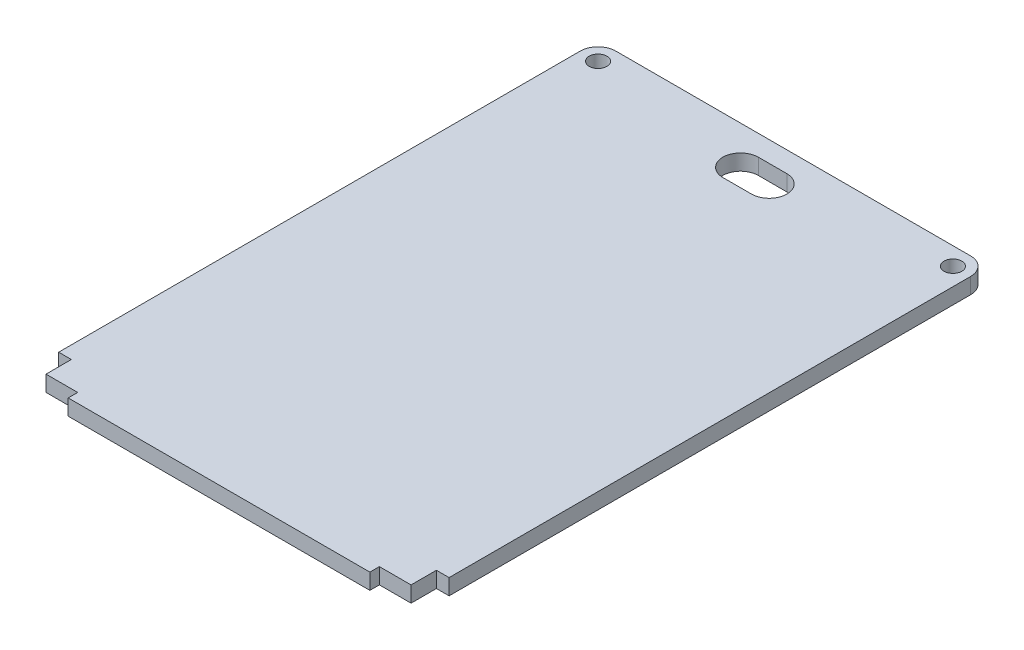
ISO-10303-21;
HEADER;
FILE_DESCRIPTION(('STEP AP214'),'2;1');
FILE_NAME('part.step','',(''),(''),'','','');
FILE_SCHEMA(('AUTOMOTIVE_DESIGN { 1 0 10303 214 1 1 1 1 }'));
ENDSEC;
DATA;
#1=APPLICATION_CONTEXT('core data for automotive mechanical design processes');
#2=APPLICATION_PROTOCOL_DEFINITION('international standard','automotive_design',2000,#1);
#3=PRODUCT_CONTEXT('',#1,'mechanical');
#4=PRODUCT('Part','Part','',(#3));
#5=PRODUCT_RELATED_PRODUCT_CATEGORY('part','',(#4));
#6=PRODUCT_DEFINITION_FORMATION('','',#4);
#7=PRODUCT_DEFINITION_CONTEXT('part definition',#1,'design');
#8=PRODUCT_DEFINITION('design','',#6,#7);
#9=PRODUCT_DEFINITION_SHAPE('','',#8);
#10=(LENGTH_UNIT() NAMED_UNIT(*) SI_UNIT(.MILLI.,.METRE.));
#11=(NAMED_UNIT(*) PLANE_ANGLE_UNIT() SI_UNIT($,.RADIAN.));
#12=(NAMED_UNIT(*) SI_UNIT($,.STERADIAN.) SOLID_ANGLE_UNIT());
#13=UNCERTAINTY_MEASURE_WITH_UNIT(LENGTH_MEASURE(1.E-05),#10,'distance_accuracy_value','');
#14=(GEOMETRIC_REPRESENTATION_CONTEXT(3) GLOBAL_UNCERTAINTY_ASSIGNED_CONTEXT((#13)) GLOBAL_UNIT_ASSIGNED_CONTEXT((#10,
#11,#12)) REPRESENTATION_CONTEXT('',''));
#15=CARTESIAN_POINT('',(0.,0.,0.));
#16=DIRECTION('',(0.,0.,1.));
#17=DIRECTION('',(1.,0.,0.));
#18=AXIS2_PLACEMENT_3D('',#15,#16,#17);
#19=CARTESIAN_POINT('',(28.,28.,-92.5));
#20=DIRECTION('',(0.,1.,0.));
#21=DIRECTION('',(0.,0.,1.));
#22=AXIS2_PLACEMENT_3D('',#19,#20,#21);
#23=PLANE('',#22);
#24=CARTESIAN_POINT('',(28.,28.,-92.5));
#25=DIRECTION('',(0.,1.,0.));
#26=DIRECTION('',(0.,0.,1.));
#27=AXIS2_PLACEMENT_3D('',#24,#25,#26);
#28=CIRCLE('',#27,1.4);
#29=CARTESIAN_POINT('',(28.,28.,-91.1));
#30=VERTEX_POINT('',#29);
#31=EDGE_CURVE('E384',#30,#30,#28,.T.);
#32=ORIENTED_EDGE('',*,*,#31,.F.);
#33=EDGE_LOOP('',(#32));
#34=FACE_BOUND('',#33,.T.);
#35=CARTESIAN_POINT('',(28.,28.,-92.5));
#36=DIRECTION('',(0.,1.,0.));
#37=DIRECTION('',(0.,0.,1.));
#38=AXIS2_PLACEMENT_3D('',#35,#36,#37);
#39=CIRCLE('',#38,2.8);
#40=CARTESIAN_POINT('',(30.8,28.,-92.5));
#41=VERTEX_POINT('',#40);
#42=CARTESIAN_POINT('',(28.,28.,-95.3));
#43=VERTEX_POINT('',#42);
#44=EDGE_CURVE('E321',#41,#43,#39,.T.);
#45=ORIENTED_EDGE('',*,*,#44,.T.);
#46=DIRECTION('',(-1.,0.,0.));
#47=VECTOR('',#46,1.);
#48=CARTESIAN_POINT('',(28.,28.,-95.3));
#49=LINE('',#48,#47);
#50=CARTESIAN_POINT('',(-28.,28.,-95.3));
#51=VERTEX_POINT('',#50);
#52=EDGE_CURVE('E365',#43,#51,#49,.T.);
#53=ORIENTED_EDGE('',*,*,#52,.T.);
#54=CARTESIAN_POINT('',(-28.,28.,-92.5));
#55=DIRECTION('',(0.,1.,0.));
#56=DIRECTION('',(0.,0.,1.));
#57=AXIS2_PLACEMENT_3D('',#54,#55,#56);
#58=CIRCLE('',#57,2.8);
#59=CARTESIAN_POINT('',(-30.8,28.,-92.5));
#60=VERTEX_POINT('',#59);
#61=EDGE_CURVE('E291',#51,#60,#58,.T.);
#62=ORIENTED_EDGE('',*,*,#61,.T.);
#63=DIRECTION('',(0.,0.,1.));
#64=VECTOR('',#63,1.);
#65=CARTESIAN_POINT('',(-30.8,28.,-92.5));
#66=LINE('',#65,#64);
#67=CARTESIAN_POINT('',(-30.8,28.,-10.2));
#68=VERTEX_POINT('',#67);
#69=EDGE_CURVE('E358',#60,#68,#66,.T.);
#70=ORIENTED_EDGE('',*,*,#69,.T.);
#71=DIRECTION('',(1.,0.,0.));
#72=VECTOR('',#71,1.);
#73=CARTESIAN_POINT('',(-28.8,28.,-10.2));
#74=LINE('',#73,#72);
#75=CARTESIAN_POINT('',(-28.8,28.,-10.2));
#76=VERTEX_POINT('',#75);
#77=EDGE_CURVE('E361',#68,#76,#74,.T.);
#78=ORIENTED_EDGE('',*,*,#77,.T.);
#79=DIRECTION('',(0.,0.,1.));
#80=VECTOR('',#79,1.);
#81=CARTESIAN_POINT('',(-28.8,28.,-6.2));
#82=LINE('',#81,#80);
#83=CARTESIAN_POINT('',(-28.8,28.,-6.2));
#84=VERTEX_POINT('',#83);
#85=EDGE_CURVE('E363',#76,#84,#82,.T.);
#86=ORIENTED_EDGE('',*,*,#85,.T.);
#87=DIRECTION('',(1.,0.,0.));
#88=VECTOR('',#87,1.);
#89=CARTESIAN_POINT('',(-28.8,28.,-6.2));
#90=LINE('',#89,#88);
#91=CARTESIAN_POINT('',(-23.8,28.,-6.2));
#92=VERTEX_POINT('',#91);
#93=EDGE_CURVE('E370',#84,#92,#90,.T.);
#94=ORIENTED_EDGE('',*,*,#93,.T.);
#95=DIRECTION('',(0.,0.,1.));
#96=VECTOR('',#95,1.);
#97=CARTESIAN_POINT('',(-23.8,28.,-6.2));
#98=LINE('',#97,#96);
#99=CARTESIAN_POINT('',(-23.8,28.,-4.70000000000001));
#100=VERTEX_POINT('',#99);
#101=EDGE_CURVE('E372',#92,#100,#98,.T.);
#102=ORIENTED_EDGE('',*,*,#101,.T.);
#103=DIRECTION('',(1.,0.,0.));
#104=VECTOR('',#103,1.);
#105=CARTESIAN_POINT('',(23.8,28.,-4.70000000000001));
#106=LINE('',#105,#104);
#107=CARTESIAN_POINT('',(23.8,28.,-4.70000000000001));
#108=VERTEX_POINT('',#107);
#109=EDGE_CURVE('E374',#100,#108,#106,.T.);
#110=ORIENTED_EDGE('',*,*,#109,.T.);
#111=DIRECTION('',(0.,0.,-1.));
#112=VECTOR('',#111,1.);
#113=CARTESIAN_POINT('',(23.8,28.,-6.2));
#114=LINE('',#113,#112);
#115=CARTESIAN_POINT('',(23.8,28.,-6.2));
#116=VERTEX_POINT('',#115);
#117=EDGE_CURVE('E376',#108,#116,#114,.T.);
#118=ORIENTED_EDGE('',*,*,#117,.T.);
#119=DIRECTION('',(1.,0.,0.));
#120=VECTOR('',#119,1.);
#121=CARTESIAN_POINT('',(28.8,28.,-6.2));
#122=LINE('',#121,#120);
#123=CARTESIAN_POINT('',(28.8,28.,-6.2));
#124=VERTEX_POINT('',#123);
#125=EDGE_CURVE('E378',#116,#124,#122,.T.);
#126=ORIENTED_EDGE('',*,*,#125,.T.);
#127=DIRECTION('',(0.,0.,-1.));
#128=VECTOR('',#127,1.);
#129=CARTESIAN_POINT('',(28.8,28.,-10.2));
#130=LINE('',#129,#128);
#131=CARTESIAN_POINT('',(28.8,28.,-10.2));
#132=VERTEX_POINT('',#131);
#133=EDGE_CURVE('E380',#124,#132,#130,.T.);
#134=ORIENTED_EDGE('',*,*,#133,.T.);
#135=DIRECTION('',(1.,0.,0.));
#136=VECTOR('',#135,1.);
#137=CARTESIAN_POINT('',(30.8,28.,-10.2));
#138=LINE('',#137,#136);
#139=CARTESIAN_POINT('',(30.8,28.,-10.2));
#140=VERTEX_POINT('',#139);
#141=EDGE_CURVE('E382',#132,#140,#138,.T.);
#142=ORIENTED_EDGE('',*,*,#141,.T.);
#143=DIRECTION('',(0.,0.,-1.));
#144=VECTOR('',#143,1.);
#145=CARTESIAN_POINT('',(30.8,28.,-10.2));
#146=LINE('',#145,#144);
#147=EDGE_CURVE('E326',#140,#41,#146,.T.);
#148=ORIENTED_EDGE('',*,*,#147,.T.);
#149=EDGE_LOOP('',(#45,#53,#62,#70,#78,#86,#94,#102,#110,#118,#126,#134,#142,#148));
#150=FACE_BOUND('',#149,.T.);
#151=CARTESIAN_POINT('',(-28.,28.,-92.5));
#152=DIRECTION('',(0.,1.,0.));
#153=DIRECTION('',(0.,0.,1.));
#154=AXIS2_PLACEMENT_3D('',#151,#152,#153);
#155=CIRCLE('',#154,1.4);
#156=CARTESIAN_POINT('',(-28.,28.,-91.1));
#157=VERTEX_POINT('',#156);
#158=EDGE_CURVE('E390',#157,#157,#155,.T.);
#159=ORIENTED_EDGE('',*,*,#158,.F.);
#160=EDGE_LOOP('',(#159));
#161=FACE_BOUND('',#160,.T.);
#162=DIRECTION('',(-1.,0.,0.));
#163=VECTOR('',#162,1.);
#164=CARTESIAN_POINT('',(2.25,28.,-92.0423380736652));
#165=LINE('',#164,#163);
#166=CARTESIAN_POINT('',(2.25,28.,-92.0423380736652));
#167=VERTEX_POINT('',#166);
#168=CARTESIAN_POINT('',(-2.25,28.,-92.0423380736652));
#169=VERTEX_POINT('',#168);
#170=EDGE_CURVE('E170',#167,#169,#165,.T.);
#171=ORIENTED_EDGE('',*,*,#170,.F.);
#172=CARTESIAN_POINT('',(2.25,28.,-86.4613645832065));
#173=CARTESIAN_POINT('',(2.61398956051497,28.,-86.4613645832065));
#174=CARTESIAN_POINT('',(3.34948815348175,28.,-86.6068249714237));
#175=CARTESIAN_POINT('',(4.59370338384372,28.,-87.4321335590209));
#176=CARTESIAN_POINT('',(5.35164207812908,28.,-89.2508015860383));
#177=CARTESIAN_POINT('',(4.45131604249703,28.,-91.4395016728447));
#178=CARTESIAN_POINT('',(2.9638113954559,28.,-92.0423380736652));
#179=CARTESIAN_POINT('',(2.25,28.,-92.0423380736652));
#180=B_SPLINE_CURVE_WITH_KNOTS('',3,(#172,#173,#174,#175,#176,#177,#178,#179),.UNSPECIFIED.,.F.,
.F.,(4,1,1,1,1,4),(1.5707963267949,1.96349540849362,2.35619449019234,3.14159265358979,
3.92699081698724,4.71238898038469),.UNSPECIFIED.);
#181=CARTESIAN_POINT('',(2.25,28.,-86.4613645832065));
#182=VERTEX_POINT('',#181);
#183=EDGE_CURVE('E162',#182,#167,#180,.T.);
#184=ORIENTED_EDGE('',*,*,#183,.F.);
#185=DIRECTION('',(1.,0.,0.));
#186=VECTOR('',#185,1.);
#187=CARTESIAN_POINT('',(-2.25,28.,-86.4613645832065));
#188=LINE('',#187,#186);
#189=CARTESIAN_POINT('',(-2.25,28.,-86.4613645832065));
#190=VERTEX_POINT('',#189);
#191=EDGE_CURVE('E184',#190,#182,#188,.T.);
#192=ORIENTED_EDGE('',*,*,#191,.F.);
#193=CARTESIAN_POINT('',(-2.25,28.,-92.0423380736652));
#194=CARTESIAN_POINT('',(-2.9638113954559,28.,-92.0423380736652));
#195=CARTESIAN_POINT('',(-4.45131604249702,28.,-91.4395016728447));
#196=CARTESIAN_POINT('',(-5.35164207812908,28.,-89.2508015860383));
#197=CARTESIAN_POINT('',(-4.59370338384372,28.,-87.4321335590209));
#198=CARTESIAN_POINT('',(-3.34948815348175,28.,-86.6068249714237));
#199=CARTESIAN_POINT('',(-2.61398956051497,28.,-86.4613645832065));
#200=CARTESIAN_POINT('',(-2.25,28.,-86.4613645832065));
#201=B_SPLINE_CURVE_WITH_KNOTS('',3,(#193,#194,#195,#196,#197,#198,#199,#200),.UNSPECIFIED.,.F.,
.F.,(4,1,1,1,1,4),(-1.5707963267949,-0.785398163397449,0.,0.785398163397448,1.17809724509617,
1.5707963267949),.UNSPECIFIED.);
#202=EDGE_CURVE('E182',#169,#190,#201,.T.);
#203=ORIENTED_EDGE('',*,*,#202,.F.);
#204=EDGE_LOOP('',(#171,#184,#192,#203));
#205=FACE_BOUND('',#204,.T.);
#206=ADVANCED_FACE('F37',(#34,#150,#161,#205),#23,.T.);
#207=CARTESIAN_POINT('',(28.,25.5,-92.5));
#208=DIRECTION('',(0.,1.,0.));
#209=DIRECTION('',(0.,0.,1.));
#210=AXIS2_PLACEMENT_3D('',#207,#208,#209);
#211=PLANE('',#210);
#212=CARTESIAN_POINT('',(-28.,25.5,-92.5));
#213=DIRECTION('',(0.,1.,0.));
#214=DIRECTION('',(0.,0.,1.));
#215=AXIS2_PLACEMENT_3D('',#212,#213,#214);
#216=CIRCLE('',#215,1.4);
#217=CARTESIAN_POINT('',(-28.,25.5,-91.1));
#218=VERTEX_POINT('',#217);
#219=EDGE_CURVE('E178',#218,#218,#216,.T.);
#220=ORIENTED_EDGE('',*,*,#219,.T.);
#221=EDGE_LOOP('',(#220));
#222=FACE_BOUND('',#221,.T.);
#223=CARTESIAN_POINT('',(28.,25.5,-92.5));
#224=DIRECTION('',(0.,1.,0.));
#225=DIRECTION('',(0.,0.,1.));
#226=AXIS2_PLACEMENT_3D('',#223,#224,#225);
#227=CIRCLE('',#226,1.4);
#228=CARTESIAN_POINT('',(28.,25.5,-91.1));
#229=VERTEX_POINT('',#228);
#230=EDGE_CURVE('E386',#229,#229,#227,.T.);
#231=ORIENTED_EDGE('',*,*,#230,.T.);
#232=EDGE_LOOP('',(#231));
#233=FACE_BOUND('',#232,.T.);
#234=CARTESIAN_POINT('',(28.,25.5,-92.5));
#235=DIRECTION('',(0.,1.,0.));
#236=DIRECTION('',(0.,0.,1.));
#237=AXIS2_PLACEMENT_3D('',#234,#235,#236);
#238=CIRCLE('',#237,2.8);
#239=CARTESIAN_POINT('',(30.8,25.5,-92.5));
#240=VERTEX_POINT('',#239);
#241=CARTESIAN_POINT('',(28.,25.5,-95.3));
#242=VERTEX_POINT('',#241);
#243=EDGE_CURVE('E287',#240,#242,#238,.T.);
#244=ORIENTED_EDGE('',*,*,#243,.F.);
#245=DIRECTION('',(0.,0.,-1.));
#246=VECTOR('',#245,1.);
#247=CARTESIAN_POINT('',(30.8,25.5,-10.2));
#248=LINE('',#247,#246);
#249=CARTESIAN_POINT('',(30.8,25.5,-10.2));
#250=VERTEX_POINT('',#249);
#251=EDGE_CURVE('E319',#250,#240,#248,.T.);
#252=ORIENTED_EDGE('',*,*,#251,.F.);
#253=DIRECTION('',(1.,0.,0.));
#254=VECTOR('',#253,1.);
#255=CARTESIAN_POINT('',(30.8,25.5,-10.2));
#256=LINE('',#255,#254);
#257=CARTESIAN_POINT('',(28.8,25.5,-10.2));
#258=VERTEX_POINT('',#257);
#259=EDGE_CURVE('E317',#258,#250,#256,.T.);
#260=ORIENTED_EDGE('',*,*,#259,.F.);
#261=DIRECTION('',(0.,0.,-1.));
#262=VECTOR('',#261,1.);
#263=CARTESIAN_POINT('',(28.8,25.5,-10.2));
#264=LINE('',#263,#262);
#265=CARTESIAN_POINT('',(28.8,25.5,-6.2));
#266=VERTEX_POINT('',#265);
#267=EDGE_CURVE('E315',#266,#258,#264,.T.);
#268=ORIENTED_EDGE('',*,*,#267,.F.);
#269=DIRECTION('',(1.,0.,0.));
#270=VECTOR('',#269,1.);
#271=CARTESIAN_POINT('',(28.8,25.5,-6.2));
#272=LINE('',#271,#270);
#273=CARTESIAN_POINT('',(23.8,25.5,-6.2));
#274=VERTEX_POINT('',#273);
#275=EDGE_CURVE('E313',#274,#266,#272,.T.);
#276=ORIENTED_EDGE('',*,*,#275,.F.);
#277=DIRECTION('',(0.,0.,-1.));
#278=VECTOR('',#277,1.);
#279=CARTESIAN_POINT('',(23.8,25.5,-6.2));
#280=LINE('',#279,#278);
#281=CARTESIAN_POINT('',(23.8,25.5,-4.70000000000001));
#282=VERTEX_POINT('',#281);
#283=EDGE_CURVE('E311',#282,#274,#280,.T.);
#284=ORIENTED_EDGE('',*,*,#283,.F.);
#285=DIRECTION('',(1.,0.,0.));
#286=VECTOR('',#285,1.);
#287=CARTESIAN_POINT('',(23.8,25.5,-4.70000000000001));
#288=LINE('',#287,#286);
#289=CARTESIAN_POINT('',(-23.8,25.5,-4.70000000000001));
#290=VERTEX_POINT('',#289);
#291=EDGE_CURVE('E309',#290,#282,#288,.T.);
#292=ORIENTED_EDGE('',*,*,#291,.F.);
#293=DIRECTION('',(0.,0.,1.));
#294=VECTOR('',#293,1.);
#295=CARTESIAN_POINT('',(-23.8,25.5,-6.2));
#296=LINE('',#295,#294);
#297=CARTESIAN_POINT('',(-23.8,25.5,-6.2));
#298=VERTEX_POINT('',#297);
#299=EDGE_CURVE('E307',#298,#290,#296,.T.);
#300=ORIENTED_EDGE('',*,*,#299,.F.);
#301=DIRECTION('',(1.,0.,0.));
#302=VECTOR('',#301,1.);
#303=CARTESIAN_POINT('',(-28.8,25.5,-6.2));
#304=LINE('',#303,#302);
#305=CARTESIAN_POINT('',(-28.8,25.5,-6.2));
#306=VERTEX_POINT('',#305);
#307=EDGE_CURVE('E305',#306,#298,#304,.T.);
#308=ORIENTED_EDGE('',*,*,#307,.F.);
#309=DIRECTION('',(0.,0.,1.));
#310=VECTOR('',#309,1.);
#311=CARTESIAN_POINT('',(-28.8,25.5,-6.2));
#312=LINE('',#311,#310);
#313=CARTESIAN_POINT('',(-28.8,25.5,-10.2));
#314=VERTEX_POINT('',#313);
#315=EDGE_CURVE('E303',#314,#306,#312,.T.);
#316=ORIENTED_EDGE('',*,*,#315,.F.);
#317=DIRECTION('',(1.,0.,0.));
#318=VECTOR('',#317,1.);
#319=CARTESIAN_POINT('',(-28.8,25.5,-10.2));
#320=LINE('',#319,#318);
#321=CARTESIAN_POINT('',(-30.8,25.5,-10.2));
#322=VERTEX_POINT('',#321);
#323=EDGE_CURVE('E298',#322,#314,#320,.T.);
#324=ORIENTED_EDGE('',*,*,#323,.F.);
#325=DIRECTION('',(0.,0.,1.));
#326=VECTOR('',#325,1.);
#327=CARTESIAN_POINT('',(-30.8,25.5,-92.5));
#328=LINE('',#327,#326);
#329=CARTESIAN_POINT('',(-30.8,25.5,-92.5));
#330=VERTEX_POINT('',#329);
#331=EDGE_CURVE('E296',#330,#322,#328,.T.);
#332=ORIENTED_EDGE('',*,*,#331,.F.);
#333=CARTESIAN_POINT('',(-28.,25.5,-92.5));
#334=DIRECTION('',(0.,1.,0.));
#335=DIRECTION('',(0.,0.,1.));
#336=AXIS2_PLACEMENT_3D('',#333,#334,#335);
#337=CIRCLE('',#336,2.8);
#338=CARTESIAN_POINT('',(-28.,25.5,-95.3));
#339=VERTEX_POINT('',#338);
#340=EDGE_CURVE('E286',#339,#330,#337,.T.);
#341=ORIENTED_EDGE('',*,*,#340,.F.);
#342=DIRECTION('',(-1.,0.,0.));
#343=VECTOR('',#342,1.);
#344=CARTESIAN_POINT('',(28.,25.5,-95.3));
#345=LINE('',#344,#343);
#346=EDGE_CURVE('E278',#242,#339,#345,.T.);
#347=ORIENTED_EDGE('',*,*,#346,.F.);
#348=EDGE_LOOP('',(#244,#252,#260,#268,#276,#284,#292,#300,#308,#316,#324,#332,#341,#347));
#349=FACE_BOUND('',#348,.T.);
#350=CARTESIAN_POINT('',(2.25,25.5,-86.4613645832065));
#351=CARTESIAN_POINT('',(2.61398956051497,25.5,-86.4613645832065));
#352=CARTESIAN_POINT('',(3.34948815348175,25.5,-86.6068249714237));
#353=CARTESIAN_POINT('',(4.59370338384372,25.5,-87.4321335590209));
#354=CARTESIAN_POINT('',(5.35164207812908,25.5,-89.2508015860383));
#355=CARTESIAN_POINT('',(4.45131604249703,25.5,-91.4395016728447));
#356=CARTESIAN_POINT('',(2.9638113954559,25.5,-92.0423380736652));
#357=CARTESIAN_POINT('',(2.25,25.5,-92.0423380736652));
#358=B_SPLINE_CURVE_WITH_KNOTS('',3,(#350,#351,#352,#353,#354,#355,#356,#357),.UNSPECIFIED.,.F.,
.F.,(4,1,1,1,1,4),(1.5707963267949,1.96349540849362,2.35619449019234,3.14159265358979,
3.92699081698724,4.71238898038469),.UNSPECIFIED.);
#359=CARTESIAN_POINT('',(2.25,25.5,-86.4613645832065));
#360=VERTEX_POINT('',#359);
#361=CARTESIAN_POINT('',(2.25,25.5,-92.0423380736652));
#362=VERTEX_POINT('',#361);
#363=EDGE_CURVE('E60',#360,#362,#358,.T.);
#364=ORIENTED_EDGE('',*,*,#363,.T.);
#365=DIRECTION('',(-1.,0.,0.));
#366=VECTOR('',#365,1.);
#367=CARTESIAN_POINT('',(2.25,25.5,-92.0423380736652));
#368=LINE('',#367,#366);
#369=CARTESIAN_POINT('',(-2.25,25.5,-92.0423380736652));
#370=VERTEX_POINT('',#369);
#371=EDGE_CURVE('E177',#362,#370,#368,.T.);
#372=ORIENTED_EDGE('',*,*,#371,.T.);
#373=CARTESIAN_POINT('',(-2.25,25.5,-92.0423380736652));
#374=CARTESIAN_POINT('',(-2.9638113954559,25.5,-92.0423380736652));
#375=CARTESIAN_POINT('',(-4.45131604249702,25.5,-91.4395016728447));
#376=CARTESIAN_POINT('',(-5.35164207812908,25.5,-89.2508015860383));
#377=CARTESIAN_POINT('',(-4.59370338384372,25.5,-87.4321335590209));
#378=CARTESIAN_POINT('',(-3.34948815348175,25.5,-86.6068249714237));
#379=CARTESIAN_POINT('',(-2.61398956051497,25.5,-86.4613645832065));
#380=CARTESIAN_POINT('',(-2.25,25.5,-86.4613645832065));
#381=B_SPLINE_CURVE_WITH_KNOTS('',3,(#373,#374,#375,#376,#377,#378,#379,#380),.UNSPECIFIED.,.F.,
.F.,(4,1,1,1,1,4),(-1.5707963267949,-0.785398163397449,0.,0.785398163397448,1.17809724509617,
1.5707963267949),.UNSPECIFIED.);
#382=CARTESIAN_POINT('',(-2.25,25.5,-86.4613645832065));
#383=VERTEX_POINT('',#382);
#384=EDGE_CURVE('E435',#370,#383,#381,.T.);
#385=ORIENTED_EDGE('',*,*,#384,.T.);
#386=DIRECTION('',(1.,0.,0.));
#387=VECTOR('',#386,1.);
#388=CARTESIAN_POINT('',(-2.25,25.5,-86.4613645832065));
#389=LINE('',#388,#387);
#390=EDGE_CURVE('E171',#383,#360,#389,.T.);
#391=ORIENTED_EDGE('',*,*,#390,.T.);
#392=EDGE_LOOP('',(#364,#372,#385,#391));
#393=FACE_BOUND('',#392,.T.);
#394=ADVANCED_FACE('F219',(#222,#233,#349,#393),#211,.F.);
#395=CARTESIAN_POINT('',(28.,28.,-92.5));
#396=DIRECTION('',(0.,-1.,0.));
#397=DIRECTION('',(0.,0.,-1.));
#398=AXIS2_PLACEMENT_3D('',#395,#396,#397);
#399=CYLINDRICAL_SURFACE('',#398,2.8);
#400=ORIENTED_EDGE('',*,*,#243,.T.);
#401=DIRECTION('',(0.,-1.,0.));
#402=VECTOR('',#401,1.);
#403=CARTESIAN_POINT('',(28.,28.,-95.3));
#404=LINE('',#403,#402);
#405=EDGE_CURVE('E11',#43,#242,#404,.T.);
#406=ORIENTED_EDGE('',*,*,#405,.F.);
#407=ORIENTED_EDGE('',*,*,#44,.F.);
#408=DIRECTION('',(0.,-1.,0.));
#409=VECTOR('',#408,1.);
#410=CARTESIAN_POINT('',(30.8,28.,-92.5));
#411=LINE('',#410,#409);
#412=EDGE_CURVE('E322',#41,#240,#411,.T.);
#413=ORIENTED_EDGE('',*,*,#412,.T.);
#414=EDGE_LOOP('',(#400,#406,#407,#413));
#415=FACE_BOUND('',#414,.T.);
#416=ADVANCED_FACE('F39',(#415),#399,.T.);
#417=CARTESIAN_POINT('',(28.,28.,-95.3));
#418=DIRECTION('',(0.,0.,1.));
#419=DIRECTION('',(0.,-1.,0.));
#420=AXIS2_PLACEMENT_3D('',#417,#418,#419);
#421=PLANE('',#420);
#422=ORIENTED_EDGE('',*,*,#346,.T.);
#423=DIRECTION('',(0.,-1.,0.));
#424=VECTOR('',#423,1.);
#425=CARTESIAN_POINT('',(-28.,28.,-95.3));
#426=LINE('',#425,#424);
#427=EDGE_CURVE('E45',#51,#339,#426,.T.);
#428=ORIENTED_EDGE('',*,*,#427,.F.);
#429=ORIENTED_EDGE('',*,*,#52,.F.);
#430=ORIENTED_EDGE('',*,*,#405,.T.);
#431=EDGE_LOOP('',(#422,#428,#429,#430));
#432=FACE_BOUND('',#431,.T.);
#433=ADVANCED_FACE('F269',(#432),#421,.F.);
#434=CARTESIAN_POINT('',(-28.,28.,-92.5));
#435=DIRECTION('',(0.,-1.,0.));
#436=DIRECTION('',(0.,0.,-1.));
#437=AXIS2_PLACEMENT_3D('',#434,#435,#436);
#438=CYLINDRICAL_SURFACE('',#437,2.8);
#439=ORIENTED_EDGE('',*,*,#340,.T.);
#440=DIRECTION('',(0.,-1.,0.));
#441=VECTOR('',#440,1.);
#442=CARTESIAN_POINT('',(-30.8,28.,-92.5));
#443=LINE('',#442,#441);
#444=EDGE_CURVE('E292',#60,#330,#443,.T.);
#445=ORIENTED_EDGE('',*,*,#444,.F.);
#446=ORIENTED_EDGE('',*,*,#61,.F.);
#447=ORIENTED_EDGE('',*,*,#427,.T.);
#448=EDGE_LOOP('',(#439,#445,#446,#447));
#449=FACE_BOUND('',#448,.T.);
#450=ADVANCED_FACE('F266',(#449),#438,.T.);
#451=CARTESIAN_POINT('',(-30.8,28.,-92.5));
#452=DIRECTION('',(1.,0.,0.));
#453=DIRECTION('',(0.,0.,-1.));
#454=AXIS2_PLACEMENT_3D('',#451,#452,#453);
#455=PLANE('',#454);
#456=ORIENTED_EDGE('',*,*,#331,.T.);
#457=DIRECTION('',(0.,-1.,0.));
#458=VECTOR('',#457,1.);
#459=CARTESIAN_POINT('',(-30.8,28.,-10.2));
#460=LINE('',#459,#458);
#461=EDGE_CURVE('E353',#68,#322,#460,.T.);
#462=ORIENTED_EDGE('',*,*,#461,.F.);
#463=ORIENTED_EDGE('',*,*,#69,.F.);
#464=ORIENTED_EDGE('',*,*,#444,.T.);
#465=EDGE_LOOP('',(#456,#462,#463,#464));
#466=FACE_BOUND('',#465,.T.);
#467=ADVANCED_FACE('F262',(#466),#455,.F.);
#468=CARTESIAN_POINT('',(-28.8,28.,-10.2));
#469=DIRECTION('',(0.,0.,-1.));
#470=DIRECTION('',(0.,1.,0.));
#471=AXIS2_PLACEMENT_3D('',#468,#469,#470);
#472=PLANE('',#471);
#473=ORIENTED_EDGE('',*,*,#323,.T.);
#474=DIRECTION('',(0.,-1.,0.));
#475=VECTOR('',#474,1.);
#476=CARTESIAN_POINT('',(-28.8,28.,-10.2));
#477=LINE('',#476,#475);
#478=EDGE_CURVE('E350',#76,#314,#477,.T.);
#479=ORIENTED_EDGE('',*,*,#478,.F.);
#480=ORIENTED_EDGE('',*,*,#77,.F.);
#481=ORIENTED_EDGE('',*,*,#461,.T.);
#482=EDGE_LOOP('',(#473,#479,#480,#481));
#483=FACE_BOUND('',#482,.T.);
#484=ADVANCED_FACE('F258',(#483),#472,.F.);
#485=CARTESIAN_POINT('',(-28.8,28.,-6.2));
#486=DIRECTION('',(1.,0.,0.));
#487=DIRECTION('',(0.,0.,-1.));
#488=AXIS2_PLACEMENT_3D('',#485,#486,#487);
#489=PLANE('',#488);
#490=ORIENTED_EDGE('',*,*,#315,.T.);
#491=DIRECTION('',(0.,-1.,0.));
#492=VECTOR('',#491,1.);
#493=CARTESIAN_POINT('',(-28.8,28.,-6.2));
#494=LINE('',#493,#492);
#495=EDGE_CURVE('E347',#84,#306,#494,.T.);
#496=ORIENTED_EDGE('',*,*,#495,.F.);
#497=ORIENTED_EDGE('',*,*,#85,.F.);
#498=ORIENTED_EDGE('',*,*,#478,.T.);
#499=EDGE_LOOP('',(#490,#496,#497,#498));
#500=FACE_BOUND('',#499,.T.);
#501=ADVANCED_FACE('F254',(#500),#489,.F.);
#502=CARTESIAN_POINT('',(-28.8,28.,-6.2));
#503=DIRECTION('',(0.,0.,-1.));
#504=DIRECTION('',(0.,1.,0.));
#505=AXIS2_PLACEMENT_3D('',#502,#503,#504);
#506=PLANE('',#505);
#507=ORIENTED_EDGE('',*,*,#307,.T.);
#508=DIRECTION('',(0.,-1.,0.));
#509=VECTOR('',#508,1.);
#510=CARTESIAN_POINT('',(-23.8,28.,-6.2));
#511=LINE('',#510,#509);
#512=EDGE_CURVE('E344',#92,#298,#511,.T.);
#513=ORIENTED_EDGE('',*,*,#512,.F.);
#514=ORIENTED_EDGE('',*,*,#93,.F.);
#515=ORIENTED_EDGE('',*,*,#495,.T.);
#516=EDGE_LOOP('',(#507,#513,#514,#515));
#517=FACE_BOUND('',#516,.T.);
#518=ADVANCED_FACE('F250',(#517),#506,.F.);
#519=CARTESIAN_POINT('',(-23.8,28.,-6.2));
#520=DIRECTION('',(1.,0.,0.));
#521=DIRECTION('',(0.,0.,-1.));
#522=AXIS2_PLACEMENT_3D('',#519,#520,#521);
#523=PLANE('',#522);
#524=ORIENTED_EDGE('',*,*,#299,.T.);
#525=DIRECTION('',(0.,-1.,0.));
#526=VECTOR('',#525,1.);
#527=CARTESIAN_POINT('',(-23.8,28.,-4.70000000000001));
#528=LINE('',#527,#526);
#529=EDGE_CURVE('E341',#100,#290,#528,.T.);
#530=ORIENTED_EDGE('',*,*,#529,.F.);
#531=ORIENTED_EDGE('',*,*,#101,.F.);
#532=ORIENTED_EDGE('',*,*,#512,.T.);
#533=EDGE_LOOP('',(#524,#530,#531,#532));
#534=FACE_BOUND('',#533,.T.);
#535=ADVANCED_FACE('F246',(#534),#523,.F.);
#536=CARTESIAN_POINT('',(23.8,28.,-4.70000000000001));
#537=DIRECTION('',(0.,0.,-1.));
#538=DIRECTION('',(-1.,0.,0.));
#539=AXIS2_PLACEMENT_3D('',#536,#537,#538);
#540=PLANE('',#539);
#541=ORIENTED_EDGE('',*,*,#291,.T.);
#542=DIRECTION('',(0.,-1.,0.));
#543=VECTOR('',#542,1.);
#544=CARTESIAN_POINT('',(23.8,28.,-4.70000000000001));
#545=LINE('',#544,#543);
#546=EDGE_CURVE('E338',#108,#282,#545,.T.);
#547=ORIENTED_EDGE('',*,*,#546,.F.);
#548=ORIENTED_EDGE('',*,*,#109,.F.);
#549=ORIENTED_EDGE('',*,*,#529,.T.);
#550=EDGE_LOOP('',(#541,#547,#548,#549));
#551=FACE_BOUND('',#550,.T.);
#552=ADVANCED_FACE('F242',(#551),#540,.F.);
#553=CARTESIAN_POINT('',(23.8,28.,-6.2));
#554=DIRECTION('',(-1.,0.,0.));
#555=DIRECTION('',(0.,0.,1.));
#556=AXIS2_PLACEMENT_3D('',#553,#554,#555);
#557=PLANE('',#556);
#558=ORIENTED_EDGE('',*,*,#283,.T.);
#559=DIRECTION('',(0.,-1.,0.));
#560=VECTOR('',#559,1.);
#561=CARTESIAN_POINT('',(23.8,28.,-6.2));
#562=LINE('',#561,#560);
#563=EDGE_CURVE('E335',#116,#274,#562,.T.);
#564=ORIENTED_EDGE('',*,*,#563,.F.);
#565=ORIENTED_EDGE('',*,*,#117,.F.);
#566=ORIENTED_EDGE('',*,*,#546,.T.);
#567=EDGE_LOOP('',(#558,#564,#565,#566));
#568=FACE_BOUND('',#567,.T.);
#569=ADVANCED_FACE('F238',(#568),#557,.F.);
#570=CARTESIAN_POINT('',(28.8,28.,-6.2));
#571=DIRECTION('',(0.,0.,-1.));
#572=DIRECTION('',(0.,1.,0.));
#573=AXIS2_PLACEMENT_3D('',#570,#571,#572);
#574=PLANE('',#573);
#575=ORIENTED_EDGE('',*,*,#275,.T.);
#576=DIRECTION('',(0.,-1.,0.));
#577=VECTOR('',#576,1.);
#578=CARTESIAN_POINT('',(28.8,28.,-6.2));
#579=LINE('',#578,#577);
#580=EDGE_CURVE('E332',#124,#266,#579,.T.);
#581=ORIENTED_EDGE('',*,*,#580,.F.);
#582=ORIENTED_EDGE('',*,*,#125,.F.);
#583=ORIENTED_EDGE('',*,*,#563,.T.);
#584=EDGE_LOOP('',(#575,#581,#582,#583));
#585=FACE_BOUND('',#584,.T.);
#586=ADVANCED_FACE('F234',(#585),#574,.F.);
#587=CARTESIAN_POINT('',(28.8,28.,-10.2));
#588=DIRECTION('',(-1.,0.,0.));
#589=DIRECTION('',(0.,0.,1.));
#590=AXIS2_PLACEMENT_3D('',#587,#588,#589);
#591=PLANE('',#590);
#592=ORIENTED_EDGE('',*,*,#267,.T.);
#593=DIRECTION('',(0.,-1.,0.));
#594=VECTOR('',#593,1.);
#595=CARTESIAN_POINT('',(28.8,28.,-10.2));
#596=LINE('',#595,#594);
#597=EDGE_CURVE('E329',#132,#258,#596,.T.);
#598=ORIENTED_EDGE('',*,*,#597,.F.);
#599=ORIENTED_EDGE('',*,*,#133,.F.);
#600=ORIENTED_EDGE('',*,*,#580,.T.);
#601=EDGE_LOOP('',(#592,#598,#599,#600));
#602=FACE_BOUND('',#601,.T.);
#603=ADVANCED_FACE('F230',(#602),#591,.F.);
#604=CARTESIAN_POINT('',(30.8,28.,-10.2));
#605=DIRECTION('',(0.,0.,-1.));
#606=DIRECTION('',(0.,1.,0.));
#607=AXIS2_PLACEMENT_3D('',#604,#605,#606);
#608=PLANE('',#607);
#609=ORIENTED_EDGE('',*,*,#259,.T.);
#610=DIRECTION('',(0.,-1.,0.));
#611=VECTOR('',#610,1.);
#612=CARTESIAN_POINT('',(30.8,28.,-10.2));
#613=LINE('',#612,#611);
#614=EDGE_CURVE('E325',#140,#250,#613,.T.);
#615=ORIENTED_EDGE('',*,*,#614,.F.);
#616=ORIENTED_EDGE('',*,*,#141,.F.);
#617=ORIENTED_EDGE('',*,*,#597,.T.);
#618=EDGE_LOOP('',(#609,#615,#616,#617));
#619=FACE_BOUND('',#618,.T.);
#620=ADVANCED_FACE('F226',(#619),#608,.F.);
#621=CARTESIAN_POINT('',(30.8,28.,-10.2));
#622=DIRECTION('',(-1.,0.,0.));
#623=DIRECTION('',(0.,0.,1.));
#624=AXIS2_PLACEMENT_3D('',#621,#622,#623);
#625=PLANE('',#624);
#626=ORIENTED_EDGE('',*,*,#251,.T.);
#627=ORIENTED_EDGE('',*,*,#412,.F.);
#628=ORIENTED_EDGE('',*,*,#147,.F.);
#629=ORIENTED_EDGE('',*,*,#614,.T.);
#630=EDGE_LOOP('',(#626,#627,#628,#629));
#631=FACE_BOUND('',#630,.T.);
#632=ADVANCED_FACE('F215',(#631),#625,.F.);
#633=CARTESIAN_POINT('',(28.,28.,-92.5));
#634=DIRECTION('',(0.,-1.,0.));
#635=DIRECTION('',(0.,0.,-1.));
#636=AXIS2_PLACEMENT_3D('',#633,#634,#635);
#637=CYLINDRICAL_SURFACE('',#636,1.4);
#638=ORIENTED_EDGE('',*,*,#31,.T.);
#639=EDGE_LOOP('',(#638));
#640=FACE_BOUND('',#639,.T.);
#641=ORIENTED_EDGE('',*,*,#230,.F.);
#642=EDGE_LOOP('',(#641));
#643=FACE_BOUND('',#642,.T.);
#644=ADVANCED_FACE('F211',(#640,#643),#637,.F.);
#645=CARTESIAN_POINT('',(-28.,28.,-92.5));
#646=DIRECTION('',(0.,-1.,0.));
#647=DIRECTION('',(0.,0.,-1.));
#648=AXIS2_PLACEMENT_3D('',#645,#646,#647);
#649=CYLINDRICAL_SURFACE('',#648,1.4);
#650=ORIENTED_EDGE('',*,*,#158,.T.);
#651=EDGE_LOOP('',(#650));
#652=FACE_BOUND('',#651,.T.);
#653=ORIENTED_EDGE('',*,*,#219,.F.);
#654=EDGE_LOOP('',(#653));
#655=FACE_BOUND('',#654,.T.);
#656=ADVANCED_FACE('F208',(#652,#655),#649,.F.);
#657=DIRECTION('',(0.,-1.,0.));
#658=VECTOR('',#657,1.);
#659=SURFACE_OF_LINEAR_EXTRUSION('',#180,#658);
#660=ORIENTED_EDGE('',*,*,#363,.F.);
#661=DIRECTION('',(0.,-1.,0.));
#662=VECTOR('',#661,1.);
#663=CARTESIAN_POINT('',(2.25,28.,-86.4613645832065));
#664=LINE('',#663,#662);
#665=EDGE_CURVE('E166',#182,#360,#664,.T.);
#666=ORIENTED_EDGE('',*,*,#665,.F.);
#667=ORIENTED_EDGE('',*,*,#183,.T.);
#668=DIRECTION('',(0.,-1.,0.));
#669=VECTOR('',#668,1.);
#670=CARTESIAN_POINT('',(2.25,28.,-92.0423380736652));
#671=LINE('',#670,#669);
#672=EDGE_CURVE('E165',#167,#362,#671,.T.);
#673=ORIENTED_EDGE('',*,*,#672,.T.);
#674=EDGE_LOOP('',(#660,#666,#667,#673));
#675=FACE_BOUND('',#674,.T.);
#676=ADVANCED_FACE('F164',(#675),#659,.T.);
#677=CARTESIAN_POINT('',(2.25,28.,-92.0423380736652));
#678=DIRECTION('',(0.,0.,1.));
#679=DIRECTION('',(0.,-1.,0.));
#680=AXIS2_PLACEMENT_3D('',#677,#678,#679);
#681=PLANE('',#680);
#682=ORIENTED_EDGE('',*,*,#371,.F.);
#683=ORIENTED_EDGE('',*,*,#672,.F.);
#684=ORIENTED_EDGE('',*,*,#170,.T.);
#685=DIRECTION('',(0.,-1.,0.));
#686=VECTOR('',#685,1.);
#687=CARTESIAN_POINT('',(-2.25,28.,-92.0423380736652));
#688=LINE('',#687,#686);
#689=EDGE_CURVE('E179',#169,#370,#688,.T.);
#690=ORIENTED_EDGE('',*,*,#689,.T.);
#691=EDGE_LOOP('',(#682,#683,#684,#690));
#692=FACE_BOUND('',#691,.T.);
#693=ADVANCED_FACE('F174',(#692),#681,.T.);
#694=DIRECTION('',(0.,-1.,0.));
#695=VECTOR('',#694,1.);
#696=SURFACE_OF_LINEAR_EXTRUSION('',#201,#695);
#697=ORIENTED_EDGE('',*,*,#384,.F.);
#698=ORIENTED_EDGE('',*,*,#689,.F.);
#699=ORIENTED_EDGE('',*,*,#202,.T.);
#700=DIRECTION('',(0.,-1.,0.));
#701=VECTOR('',#700,1.);
#702=CARTESIAN_POINT('',(-2.25,28.,-86.4613645832065));
#703=LINE('',#702,#701);
#704=EDGE_CURVE('E52',#190,#383,#703,.T.);
#705=ORIENTED_EDGE('',*,*,#704,.T.);
#706=EDGE_LOOP('',(#697,#698,#699,#705));
#707=FACE_BOUND('',#706,.T.);
#708=ADVANCED_FACE('F198',(#707),#696,.T.);
#709=CARTESIAN_POINT('',(-2.25,28.,-86.4613645832065));
#710=DIRECTION('',(0.,0.,-1.));
#711=DIRECTION('',(0.,1.,0.));
#712=AXIS2_PLACEMENT_3D('',#709,#710,#711);
#713=PLANE('',#712);
#714=ORIENTED_EDGE('',*,*,#390,.F.);
#715=ORIENTED_EDGE('',*,*,#704,.F.);
#716=ORIENTED_EDGE('',*,*,#191,.T.);
#717=ORIENTED_EDGE('',*,*,#665,.T.);
#718=EDGE_LOOP('',(#714,#715,#716,#717));
#719=FACE_BOUND('',#718,.T.);
#720=ADVANCED_FACE('F202',(#719),#713,.T.);
#721=CLOSED_SHELL('',(#206,#394,#416,#433,#450,#467,#484,#501,#518,#535,#552,#569,#586,#603,
#620,#632,#644,#656,#676,#693,#708,#720));
#722=MANIFOLD_SOLID_BREP('B2',#721);
#723=ADVANCED_BREP_SHAPE_REPRESENTATION('',(#18,#722),#14);
#724=SHAPE_DEFINITION_REPRESENTATION(#9,#723);
ENDSEC;
END-ISO-10303-21;
